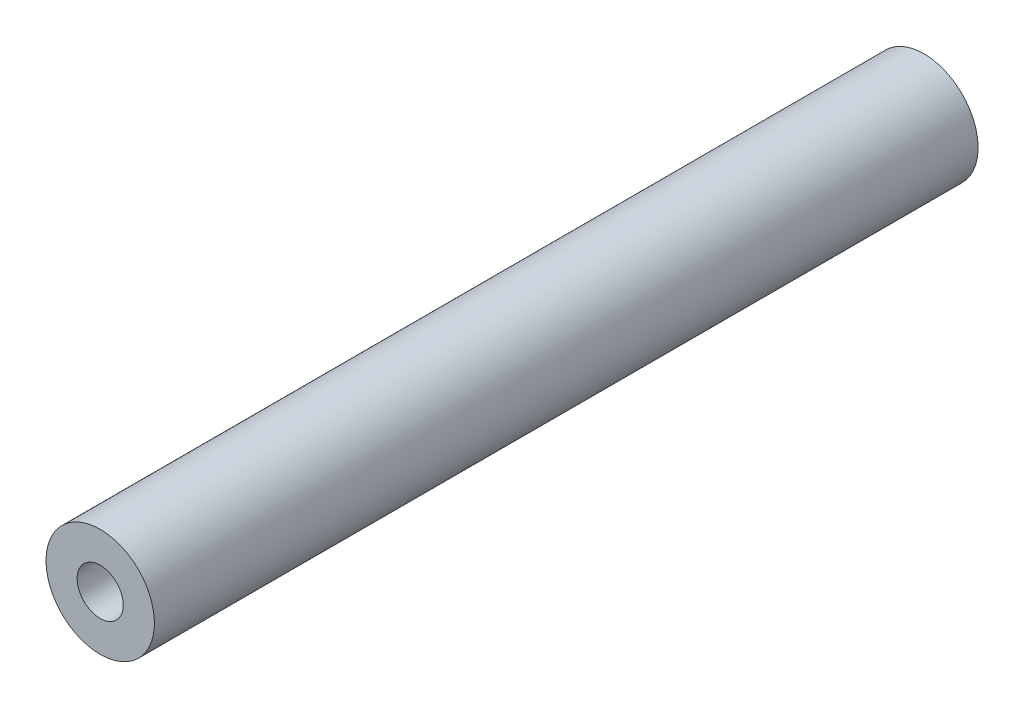
ISO-10303-21;
HEADER;
FILE_DESCRIPTION(('STEP AP214'),'2;1');
FILE_NAME('part.step','',(''),(''),'','','');
FILE_SCHEMA(('AUTOMOTIVE_DESIGN { 1 0 10303 214 1 1 1 1 }'));
ENDSEC;
DATA;
#1=APPLICATION_CONTEXT('core data for automotive mechanical design processes');
#2=APPLICATION_PROTOCOL_DEFINITION('international standard','automotive_design',2000,#1);
#3=PRODUCT_CONTEXT('',#1,'mechanical');
#4=PRODUCT('Part','Part','',(#3));
#5=PRODUCT_RELATED_PRODUCT_CATEGORY('part','',(#4));
#6=PRODUCT_DEFINITION_FORMATION('','',#4);
#7=PRODUCT_DEFINITION_CONTEXT('part definition',#1,'design');
#8=PRODUCT_DEFINITION('design','',#6,#7);
#9=PRODUCT_DEFINITION_SHAPE('','',#8);
#10=(LENGTH_UNIT() NAMED_UNIT(*) SI_UNIT(.MILLI.,.METRE.));
#11=(NAMED_UNIT(*) PLANE_ANGLE_UNIT() SI_UNIT($,.RADIAN.));
#12=(NAMED_UNIT(*) SI_UNIT($,.STERADIAN.) SOLID_ANGLE_UNIT());
#13=UNCERTAINTY_MEASURE_WITH_UNIT(LENGTH_MEASURE(1.E-05),#10,'distance_accuracy_value','');
#14=(GEOMETRIC_REPRESENTATION_CONTEXT(3) GLOBAL_UNCERTAINTY_ASSIGNED_CONTEXT((#13)) GLOBAL_UNIT_ASSIGNED_CONTEXT((#10,
#11,#12)) REPRESENTATION_CONTEXT('',''));
#15=CARTESIAN_POINT('',(0.,0.,0.));
#16=DIRECTION('',(0.,0.,1.));
#17=DIRECTION('',(1.,0.,0.));
#18=AXIS2_PLACEMENT_3D('',#15,#16,#17);
#19=CARTESIAN_POINT('',(0.,0.,48.26));
#20=DIRECTION('',(0.,0.,-1.));
#21=DIRECTION('',(-1.,0.,0.));
#22=AXIS2_PLACEMENT_3D('',#19,#20,#21);
#23=CYLINDRICAL_SURFACE('',#22,3.175);
#24=CARTESIAN_POINT('',(0.,0.,48.26));
#25=DIRECTION('',(0.,0.,1.));
#26=DIRECTION('',(1.,0.,0.));
#27=AXIS2_PLACEMENT_3D('',#24,#25,#26);
#28=CIRCLE('',#27,3.175);
#29=CARTESIAN_POINT('',(-3.175,0.,48.26));
#30=VERTEX_POINT('',#29);
#31=EDGE_CURVE('E11',#30,#30,#28,.T.);
#32=CARTESIAN_POINT('',(0.,0.,0.));
#33=DIRECTION('',(0.,0.,1.));
#34=DIRECTION('',(1.,0.,0.));
#35=AXIS2_PLACEMENT_3D('',#32,#33,#34);
#36=CIRCLE('',#35,3.175);
#37=CARTESIAN_POINT('',(-3.175,0.,0.));
#38=VERTEX_POINT('',#37);
#39=EDGE_CURVE('E46',#38,#38,#36,.T.);
#40=CARTESIAN_POINT('',(-3.175,0.,48.26));
#41=CARTESIAN_POINT('',(-3.175,0.,47.7572916666667));
#42=CARTESIAN_POINT('',(-3.175,0.,47.2545833333333));
#43=CARTESIAN_POINT('',(-3.175,0.,46.2491666666667));
#44=CARTESIAN_POINT('',(-3.175,0.,45.7464583333333));
#45=CARTESIAN_POINT('',(-3.175,0.,44.7410416666667));
#46=CARTESIAN_POINT('',(-3.175,0.,44.2383333333333));
#47=CARTESIAN_POINT('',(-3.175,0.,43.2329166666667));
#48=CARTESIAN_POINT('',(-3.175,0.,42.7302083333333));
#49=CARTESIAN_POINT('',(-3.175,0.,41.7247916666667));
#50=CARTESIAN_POINT('',(-3.175,0.,41.2220833333333));
#51=CARTESIAN_POINT('',(-3.175,0.,40.2166666666667));
#52=CARTESIAN_POINT('',(-3.175,0.,39.7139583333333));
#53=CARTESIAN_POINT('',(-3.175,0.,38.7085416666667));
#54=CARTESIAN_POINT('',(-3.175,0.,38.2058333333333));
#55=CARTESIAN_POINT('',(-3.175,0.,37.2004166666667));
#56=CARTESIAN_POINT('',(-3.175,0.,36.6977083333333));
#57=CARTESIAN_POINT('',(-3.175,0.,35.6922916666667));
#58=CARTESIAN_POINT('',(-3.175,0.,35.1895833333333));
#59=CARTESIAN_POINT('',(-3.175,0.,34.1841666666667));
#60=CARTESIAN_POINT('',(-3.175,0.,33.6814583333333));
#61=CARTESIAN_POINT('',(-3.175,0.,32.6760416666667));
#62=CARTESIAN_POINT('',(-3.175,0.,32.1733333333333));
#63=CARTESIAN_POINT('',(-3.175,0.,31.1679166666667));
#64=CARTESIAN_POINT('',(-3.175,0.,30.6652083333333));
#65=CARTESIAN_POINT('',(-3.175,0.,29.6597916666667));
#66=CARTESIAN_POINT('',(-3.175,0.,29.1570833333333));
#67=CARTESIAN_POINT('',(-3.175,0.,28.1516666666667));
#68=CARTESIAN_POINT('',(-3.175,0.,27.6489583333333));
#69=CARTESIAN_POINT('',(-3.175,0.,26.6435416666667));
#70=CARTESIAN_POINT('',(-3.175,0.,26.1408333333333));
#71=CARTESIAN_POINT('',(-3.175,0.,25.1354166666667));
#72=CARTESIAN_POINT('',(-3.175,0.,24.6327083333333));
#73=CARTESIAN_POINT('',(-3.175,0.,23.6272916666667));
#74=CARTESIAN_POINT('',(-3.175,0.,23.1245833333333));
#75=CARTESIAN_POINT('',(-3.175,0.,22.1191666666667));
#76=CARTESIAN_POINT('',(-3.175,0.,21.6164583333333));
#77=CARTESIAN_POINT('',(-3.175,0.,20.6110416666667));
#78=CARTESIAN_POINT('',(-3.175,0.,20.1083333333333));
#79=CARTESIAN_POINT('',(-3.175,0.,19.1029166666667));
#80=CARTESIAN_POINT('',(-3.175,0.,18.6002083333333));
#81=CARTESIAN_POINT('',(-3.175,0.,17.5947916666667));
#82=CARTESIAN_POINT('',(-3.175,0.,17.0920833333333));
#83=CARTESIAN_POINT('',(-3.175,0.,16.0866666666667));
#84=CARTESIAN_POINT('',(-3.175,0.,15.5839583333333));
#85=CARTESIAN_POINT('',(-3.175,0.,14.5785416666667));
#86=CARTESIAN_POINT('',(-3.175,0.,14.0758333333333));
#87=CARTESIAN_POINT('',(-3.175,0.,13.0704166666667));
#88=CARTESIAN_POINT('',(-3.175,0.,12.5677083333333));
#89=CARTESIAN_POINT('',(-3.175,0.,11.5622916666667));
#90=CARTESIAN_POINT('',(-3.175,0.,11.0595833333333));
#91=CARTESIAN_POINT('',(-3.175,0.,10.0541666666667));
#92=CARTESIAN_POINT('',(-3.175,0.,9.55145833333333));
#93=CARTESIAN_POINT('',(-3.175,0.,8.54604166666666));
#94=CARTESIAN_POINT('',(-3.175,0.,8.04333333333333));
#95=CARTESIAN_POINT('',(-3.175,0.,7.03791666666666));
#96=CARTESIAN_POINT('',(-3.175,0.,6.53520833333333));
#97=CARTESIAN_POINT('',(-3.175,0.,5.52979166666666));
#98=CARTESIAN_POINT('',(-3.175,0.,5.02708333333333));
#99=CARTESIAN_POINT('',(-3.175,0.,4.02166666666666));
#100=CARTESIAN_POINT('',(-3.175,0.,3.51895833333332));
#101=CARTESIAN_POINT('',(-3.175,0.,2.51354166666666));
#102=CARTESIAN_POINT('',(-3.175,0.,2.01083333333333));
#103=CARTESIAN_POINT('',(-3.175,0.,1.00541666666666));
#104=CARTESIAN_POINT('',(-3.175,0.,0.502708333333326));
#105=CARTESIAN_POINT('',(-3.175,0.,0.));
#106=B_SPLINE_CURVE_WITH_KNOTS('',3,(#40,#41,#42,#43,#44,#45,#46,#47,#48,#49,#50,#51,#52,#53,
#54,#55,#56,#57,#58,#59,#60,#61,#62,#63,#64,#65,#66,#67,#68,#69,#70,#71,#72,#73,#74,#75,#76,#77,
#78,#79,#80,#81,#82,#83,#84,#85,#86,#87,#88,#89,#90,#91,#92,#93,#94,#95,#96,#97,#98,#99,#100,
#101,#102,#103,#104,#105),.UNSPECIFIED.,.F.,.F.,(4,2,2,2,2,2,2,2,2,2,2,2,2,2,2,2,2,2,2,2,2,2,2,
2,2,2,2,2,2,2,2,2,4),(0.,1.508125,3.01625,4.524375,6.0325,7.540625,9.04874999999999,10.556875,
12.065,13.573125,15.08125,16.589375,18.0975,19.605625,21.11375,22.621875,24.13,25.638125,
27.14625,28.654375,30.1625,31.670625,33.17875,34.686875,36.195,37.703125,39.21125,40.719375,
42.2275,43.735625,45.24375,46.751875,48.26),.UNSPECIFIED.);
#107=EDGE_CURVE('BSEAM43',#30,#38,#106,.T.);
#108=ORIENTED_EDGE('',*,*,#31,.F.);
#109=ORIENTED_EDGE('',*,*,#39,.T.);
#110=ORIENTED_EDGE('',*,*,#107,.T.);
#111=ORIENTED_EDGE('',*,*,#107,.F.);
#112=EDGE_LOOP('',(#108,#110,#109,#111));
#113=FACE_BOUND('',#112,.T.);
#114=ADVANCED_FACE('F43',(#113),#23,.T.);
#115=CARTESIAN_POINT('',(0.,0.,48.26));
#116=DIRECTION('',(0.,0.,1.));
#117=DIRECTION('',(1.,0.,0.));
#118=AXIS2_PLACEMENT_3D('',#115,#116,#117);
#119=PLANE('',#118);
#120=CARTESIAN_POINT('',(0.,0.,48.26));
#121=DIRECTION('',(0.,0.,1.));
#122=DIRECTION('',(1.,0.,0.));
#123=AXIS2_PLACEMENT_3D('',#120,#121,#122);
#124=CIRCLE('',#123,1.35254999999999);
#125=CARTESIAN_POINT('',(1.35254999999999,0.,48.26));
#126=VERTEX_POINT('',#125);
#127=EDGE_CURVE('E66',#126,#126,#124,.T.);
#128=ORIENTED_EDGE('',*,*,#127,.F.);
#129=EDGE_LOOP('',(#128));
#130=FACE_BOUND('',#129,.T.);
#131=ORIENTED_EDGE('',*,*,#31,.T.);
#132=EDGE_LOOP('',(#131));
#133=FACE_BOUND('',#132,.T.);
#134=ADVANCED_FACE('F85',(#130,#133),#119,.T.);
#135=CARTESIAN_POINT('',(0.,0.,0.));
#136=DIRECTION('',(0.,0.,1.));
#137=DIRECTION('',(1.,0.,0.));
#138=AXIS2_PLACEMENT_3D('',#135,#136,#137);
#139=PLANE('',#138);
#140=CARTESIAN_POINT('',(0.,0.,0.));
#141=DIRECTION('',(0.,0.,-1.));
#142=DIRECTION('',(-1.,0.,0.));
#143=AXIS2_PLACEMENT_3D('',#140,#141,#142);
#144=CIRCLE('',#143,1.35254999999999);
#145=CARTESIAN_POINT('',(-1.35254999999999,0.,0.));
#146=VERTEX_POINT('',#145);
#147=EDGE_CURVE('E67',#146,#146,#144,.T.);
#148=ORIENTED_EDGE('',*,*,#147,.F.);
#149=EDGE_LOOP('',(#148));
#150=FACE_BOUND('',#149,.T.);
#151=ORIENTED_EDGE('',*,*,#39,.F.);
#152=EDGE_LOOP('',(#151));
#153=FACE_BOUND('',#152,.T.);
#154=ADVANCED_FACE('F82',(#150,#153),#139,.F.);
#155=CARTESIAN_POINT('',(0.,0.,35.56));
#156=DIRECTION('',(0.,0.,1.));
#157=DIRECTION('',(1.,0.,0.));
#158=AXIS2_PLACEMENT_3D('',#155,#156,#157);
#159=CONICAL_SURFACE('',#158,1.35254999999999,1.02974425867665);
#160=CARTESIAN_POINT('',(0.,0.,34.7473059697343));
#161=VERTEX_POINT('',#160);
#162=VERTEX_LOOP('',#161);
#163=FACE_BOUND('',#162,.T.);
#164=CARTESIAN_POINT('',(0.,0.,35.56));
#165=DIRECTION('',(0.,0.,1.));
#166=DIRECTION('',(1.,0.,0.));
#167=AXIS2_PLACEMENT_3D('',#164,#165,#166);
#168=CIRCLE('',#167,1.35254999999999);
#169=CARTESIAN_POINT('',(1.35254999999999,0.,35.56));
#170=VERTEX_POINT('',#169);
#171=EDGE_CURVE('E70',#170,#170,#168,.T.);
#172=ORIENTED_EDGE('',*,*,#171,.T.);
#173=EDGE_LOOP('',(#172));
#174=FACE_BOUND('',#173,.T.);
#175=ADVANCED_FACE('F84',(#163,#174),#159,.F.);
#176=CARTESIAN_POINT('',(0.,0.,48.26));
#177=DIRECTION('',(0.,0.,1.));
#178=DIRECTION('',(1.,0.,0.));
#179=AXIS2_PLACEMENT_3D('',#176,#177,#178);
#180=CYLINDRICAL_SURFACE('',#179,1.35254999999999);
#181=ORIENTED_EDGE('',*,*,#171,.F.);
#182=EDGE_LOOP('',(#181));
#183=FACE_BOUND('',#182,.T.);
#184=ORIENTED_EDGE('',*,*,#127,.T.);
#185=EDGE_LOOP('',(#184));
#186=FACE_BOUND('',#185,.T.);
#187=ADVANCED_FACE('F60',(#183,#186),#180,.F.);
#188=CARTESIAN_POINT('',(0.,0.,12.7));
#189=DIRECTION('',(0.,0.,-1.));
#190=DIRECTION('',(-1.,0.,0.));
#191=AXIS2_PLACEMENT_3D('',#188,#189,#190);
#192=CONICAL_SURFACE('',#191,1.35254999999999,1.02974425867665);
#193=CARTESIAN_POINT('',(0.,0.,13.5126940302657));
#194=VERTEX_POINT('',#193);
#195=VERTEX_LOOP('',#194);
#196=FACE_BOUND('',#195,.T.);
#197=CARTESIAN_POINT('',(0.,0.,12.7));
#198=DIRECTION('',(0.,0.,-1.));
#199=DIRECTION('',(-1.,0.,0.));
#200=AXIS2_PLACEMENT_3D('',#197,#198,#199);
#201=CIRCLE('',#200,1.35254999999999);
#202=CARTESIAN_POINT('',(-1.35254999999999,0.,12.7));
#203=VERTEX_POINT('',#202);
#204=EDGE_CURVE('E64',#203,#203,#201,.T.);
#205=ORIENTED_EDGE('',*,*,#204,.T.);
#206=EDGE_LOOP('',(#205));
#207=FACE_BOUND('',#206,.T.);
#208=ADVANCED_FACE('F56',(#196,#207),#192,.F.);
#209=CARTESIAN_POINT('',(0.,0.,0.));
#210=DIRECTION('',(0.,0.,-1.));
#211=DIRECTION('',(-1.,0.,0.));
#212=AXIS2_PLACEMENT_3D('',#209,#210,#211);
#213=CYLINDRICAL_SURFACE('',#212,1.35254999999999);
#214=ORIENTED_EDGE('',*,*,#204,.F.);
#215=EDGE_LOOP('',(#214));
#216=FACE_BOUND('',#215,.T.);
#217=ORIENTED_EDGE('',*,*,#147,.T.);
#218=EDGE_LOOP('',(#217));
#219=FACE_BOUND('',#218,.T.);
#220=ADVANCED_FACE('F59',(#216,#219),#213,.F.);
#221=CLOSED_SHELL('',(#114,#134,#154,#175,#187,#208,#220));
#222=MANIFOLD_SOLID_BREP('B2',#221);
#223=ADVANCED_BREP_SHAPE_REPRESENTATION('',(#18,#222),#14);
#224=SHAPE_DEFINITION_REPRESENTATION(#9,#223);
ENDSEC;
END-ISO-10303-21;
